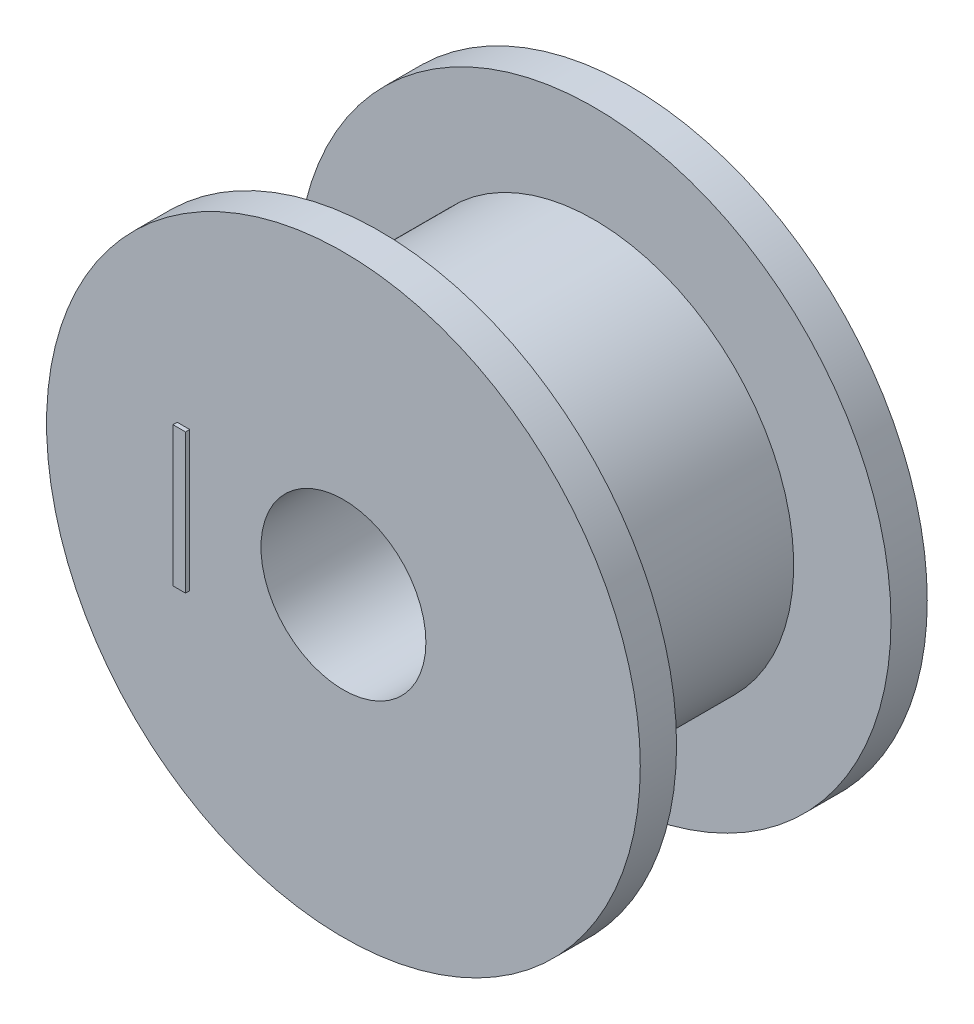
ISO-10303-21;
HEADER;
FILE_DESCRIPTION(('STEP AP214'),'2;1');
FILE_NAME('part.step','',(''),(''),'','','');
FILE_SCHEMA(('AUTOMOTIVE_DESIGN { 1 0 10303 214 1 1 1 1 }'));
ENDSEC;
DATA;
#1=APPLICATION_CONTEXT('core data for automotive mechanical design processes');
#2=APPLICATION_PROTOCOL_DEFINITION('international standard','automotive_design',2000,#1);
#3=PRODUCT_CONTEXT('',#1,'mechanical');
#4=PRODUCT('Part','Part','',(#3));
#5=PRODUCT_RELATED_PRODUCT_CATEGORY('part','',(#4));
#6=PRODUCT_DEFINITION_FORMATION('','',#4);
#7=PRODUCT_DEFINITION_CONTEXT('part definition',#1,'design');
#8=PRODUCT_DEFINITION('design','',#6,#7);
#9=PRODUCT_DEFINITION_SHAPE('','',#8);
#10=(LENGTH_UNIT() NAMED_UNIT(*) SI_UNIT(.MILLI.,.METRE.));
#11=(NAMED_UNIT(*) PLANE_ANGLE_UNIT() SI_UNIT($,.RADIAN.));
#12=(NAMED_UNIT(*) SI_UNIT($,.STERADIAN.) SOLID_ANGLE_UNIT());
#13=UNCERTAINTY_MEASURE_WITH_UNIT(LENGTH_MEASURE(1.E-05),#10,'distance_accuracy_value','');
#14=(GEOMETRIC_REPRESENTATION_CONTEXT(3) GLOBAL_UNCERTAINTY_ASSIGNED_CONTEXT((#13)) GLOBAL_UNIT_ASSIGNED_CONTEXT((#10,
#11,#12)) REPRESENTATION_CONTEXT('',''));
#15=CARTESIAN_POINT('',(0.,0.,0.));
#16=DIRECTION('',(0.,0.,1.));
#17=DIRECTION('',(1.,0.,0.));
#18=AXIS2_PLACEMENT_3D('',#15,#16,#17);
#19=CARTESIAN_POINT('',(0.,0.,1.1));
#20=DIRECTION('',(0.,0.,-1.));
#21=DIRECTION('',(-1.,0.,0.));
#22=AXIS2_PLACEMENT_3D('',#19,#20,#21);
#23=CYLINDRICAL_SURFACE('',#22,9.);
#24=CARTESIAN_POINT('',(0.,0.,1.1));
#25=DIRECTION('',(0.,0.,1.));
#26=DIRECTION('',(1.,0.,0.));
#27=AXIS2_PLACEMENT_3D('',#24,#25,#26);
#28=CIRCLE('',#27,9.);
#29=CARTESIAN_POINT('',(9.,0.,1.1));
#30=VERTEX_POINT('',#29);
#31=EDGE_CURVE('E11',#30,#30,#28,.T.);
#32=ORIENTED_EDGE('',*,*,#31,.F.);
#33=EDGE_LOOP('',(#32));
#34=FACE_BOUND('',#33,.T.);
#35=CARTESIAN_POINT('',(0.,0.,0.));
#36=DIRECTION('',(0.,0.,1.));
#37=DIRECTION('',(1.,0.,0.));
#38=AXIS2_PLACEMENT_3D('',#35,#36,#37);
#39=CIRCLE('',#38,9.);
#40=CARTESIAN_POINT('',(9.,0.,0.));
#41=VERTEX_POINT('',#40);
#42=EDGE_CURVE('E35',#41,#41,#39,.T.);
#43=ORIENTED_EDGE('',*,*,#42,.T.);
#44=EDGE_LOOP('',(#43));
#45=FACE_BOUND('',#44,.T.);
#46=ADVANCED_FACE('F32',(#34,#45),#23,.T.);
#47=CARTESIAN_POINT('',(0.,0.,1.1));
#48=DIRECTION('',(0.,0.,1.));
#49=DIRECTION('',(1.,0.,0.));
#50=AXIS2_PLACEMENT_3D('',#47,#48,#49);
#51=PLANE('',#50);
#52=CARTESIAN_POINT('',(0.,0.,1.1));
#53=DIRECTION('',(0.,0.,1.));
#54=DIRECTION('',(1.,0.,0.));
#55=AXIS2_PLACEMENT_3D('',#52,#53,#54);
#56=CIRCLE('',#55,6.05);
#57=CARTESIAN_POINT('',(-6.05,0.,1.1));
#58=VERTEX_POINT('',#57);
#59=EDGE_CURVE('E119',#58,#58,#56,.T.);
#60=ORIENTED_EDGE('',*,*,#59,.F.);
#61=EDGE_LOOP('',(#60));
#62=FACE_BOUND('',#61,.T.);
#63=ORIENTED_EDGE('',*,*,#31,.T.);
#64=EDGE_LOOP('',(#63));
#65=FACE_BOUND('',#64,.T.);
#66=ADVANCED_FACE('F130',(#62,#65),#51,.T.);
#67=CARTESIAN_POINT('',(0.,0.,0.));
#68=DIRECTION('',(0.,0.,1.));
#69=DIRECTION('',(1.,0.,0.));
#70=AXIS2_PLACEMENT_3D('',#67,#68,#69);
#71=PLANE('',#70);
#72=CARTESIAN_POINT('',(0.,0.,0.));
#73=DIRECTION('',(0.,0.,1.));
#74=DIRECTION('',(1.,0.,0.));
#75=AXIS2_PLACEMENT_3D('',#72,#73,#74);
#76=CIRCLE('',#75,2.5);
#77=CARTESIAN_POINT('',(2.5,0.,0.));
#78=VERTEX_POINT('',#77);
#79=EDGE_CURVE('E112',#78,#78,#76,.F.);
#80=ORIENTED_EDGE('',*,*,#79,.F.);
#81=EDGE_LOOP('',(#80));
#82=FACE_BOUND('',#81,.T.);
#83=ORIENTED_EDGE('',*,*,#42,.F.);
#84=EDGE_LOOP('',(#83));
#85=FACE_BOUND('',#84,.T.);
#86=ADVANCED_FACE('F133',(#82,#85),#71,.F.);
#87=CARTESIAN_POINT('',(0.,0.,7.6));
#88=DIRECTION('',(0.,0.,-1.));
#89=DIRECTION('',(-1.,0.,0.));
#90=AXIS2_PLACEMENT_3D('',#87,#88,#89);
#91=CYLINDRICAL_SURFACE('',#90,6.05);
#92=CARTESIAN_POINT('',(0.,0.,7.6));
#93=DIRECTION('',(0.,0.,1.));
#94=DIRECTION('',(1.,0.,0.));
#95=AXIS2_PLACEMENT_3D('',#92,#93,#94);
#96=CIRCLE('',#95,6.05);
#97=CARTESIAN_POINT('',(-6.05,0.,7.6));
#98=VERTEX_POINT('',#97);
#99=EDGE_CURVE('E122',#98,#98,#96,.T.);
#100=CARTESIAN_POINT('',(-6.05,0.,7.6));
#101=CARTESIAN_POINT('',(-6.05,0.,7.53229166666667));
#102=CARTESIAN_POINT('',(-6.05,0.,7.46458333333333));
#103=CARTESIAN_POINT('',(-6.05,0.,7.32916666666666));
#104=CARTESIAN_POINT('',(-6.05,0.,7.26145833333333));
#105=CARTESIAN_POINT('',(-6.05,0.,7.12604166666666));
#106=CARTESIAN_POINT('',(-6.05,0.,7.05833333333333));
#107=CARTESIAN_POINT('',(-6.05,0.,6.92291666666666));
#108=CARTESIAN_POINT('',(-6.05,0.,6.85520833333333));
#109=CARTESIAN_POINT('',(-6.05,0.,6.71979166666667));
#110=CARTESIAN_POINT('',(-6.05,0.,6.65208333333333));
#111=CARTESIAN_POINT('',(-6.05,0.,6.51666666666667));
#112=CARTESIAN_POINT('',(-6.05,0.,6.44895833333333));
#113=CARTESIAN_POINT('',(-6.05,0.,6.31354166666666));
#114=CARTESIAN_POINT('',(-6.05,0.,6.24583333333333));
#115=CARTESIAN_POINT('',(-6.05,0.,6.11041666666667));
#116=CARTESIAN_POINT('',(-6.05,0.,6.04270833333333));
#117=CARTESIAN_POINT('',(-6.05,0.,5.90729166666667));
#118=CARTESIAN_POINT('',(-6.05,0.,5.83958333333333));
#119=CARTESIAN_POINT('',(-6.05,0.,5.70416666666667));
#120=CARTESIAN_POINT('',(-6.05,0.,5.63645833333333));
#121=CARTESIAN_POINT('',(-6.05,0.,5.50104166666667));
#122=CARTESIAN_POINT('',(-6.05,0.,5.43333333333333));
#123=CARTESIAN_POINT('',(-6.05,0.,5.29791666666666));
#124=CARTESIAN_POINT('',(-6.05,0.,5.23020833333333));
#125=CARTESIAN_POINT('',(-6.05,0.,5.09479166666667));
#126=CARTESIAN_POINT('',(-6.05,0.,5.02708333333333));
#127=CARTESIAN_POINT('',(-6.05,0.,4.89166666666667));
#128=CARTESIAN_POINT('',(-6.05,0.,4.82395833333333));
#129=CARTESIAN_POINT('',(-6.05,0.,4.68854166666667));
#130=CARTESIAN_POINT('',(-6.05,0.,4.62083333333333));
#131=CARTESIAN_POINT('',(-6.05,0.,4.48541666666667));
#132=CARTESIAN_POINT('',(-6.05,0.,4.41770833333333));
#133=CARTESIAN_POINT('',(-6.05,0.,4.28229166666667));
#134=CARTESIAN_POINT('',(-6.05,0.,4.21458333333333));
#135=CARTESIAN_POINT('',(-6.05,0.,4.07916666666667));
#136=CARTESIAN_POINT('',(-6.05,0.,4.01145833333333));
#137=CARTESIAN_POINT('',(-6.05,0.,3.87604166666667));
#138=CARTESIAN_POINT('',(-6.05,0.,3.80833333333333));
#139=CARTESIAN_POINT('',(-6.05,0.,3.67291666666667));
#140=CARTESIAN_POINT('',(-6.05,0.,3.60520833333333));
#141=CARTESIAN_POINT('',(-6.05,0.,3.46979166666667));
#142=CARTESIAN_POINT('',(-6.05,0.,3.40208333333333));
#143=CARTESIAN_POINT('',(-6.05,0.,3.26666666666667));
#144=CARTESIAN_POINT('',(-6.05,0.,3.19895833333333));
#145=CARTESIAN_POINT('',(-6.05,0.,3.06354166666667));
#146=CARTESIAN_POINT('',(-6.05,0.,2.99583333333333));
#147=CARTESIAN_POINT('',(-6.05,0.,2.86041666666667));
#148=CARTESIAN_POINT('',(-6.05,0.,2.79270833333333));
#149=CARTESIAN_POINT('',(-6.05,0.,2.65729166666667));
#150=CARTESIAN_POINT('',(-6.05,0.,2.58958333333333));
#151=CARTESIAN_POINT('',(-6.05,0.,2.45416666666667));
#152=CARTESIAN_POINT('',(-6.05,0.,2.38645833333333));
#153=CARTESIAN_POINT('',(-6.05,0.,2.25104166666667));
#154=CARTESIAN_POINT('',(-6.05,0.,2.18333333333333));
#155=CARTESIAN_POINT('',(-6.05,0.,2.04791666666667));
#156=CARTESIAN_POINT('',(-6.05,0.,1.98020833333333));
#157=CARTESIAN_POINT('',(-6.05,0.,1.84479166666667));
#158=CARTESIAN_POINT('',(-6.05,0.,1.77708333333333));
#159=CARTESIAN_POINT('',(-6.05,0.,1.64166666666667));
#160=CARTESIAN_POINT('',(-6.05,0.,1.57395833333333));
#161=CARTESIAN_POINT('',(-6.05,0.,1.43854166666667));
#162=CARTESIAN_POINT('',(-6.05,0.,1.37083333333333));
#163=CARTESIAN_POINT('',(-6.05,0.,1.23541666666667));
#164=CARTESIAN_POINT('',(-6.05,0.,1.16770833333333));
#165=CARTESIAN_POINT('',(-6.05,0.,1.1));
#166=B_SPLINE_CURVE_WITH_KNOTS('',3,(#100,#101,#102,#103,#104,#105,#106,#107,#108,#109,#110,
#111,#112,#113,#114,#115,#116,#117,#118,#119,#120,#121,#122,#123,#124,#125,#126,#127,#128,#129,
#130,#131,#132,#133,#134,#135,#136,#137,#138,#139,#140,#141,#142,#143,#144,#145,#146,#147,#148,
#149,#150,#151,#152,#153,#154,#155,#156,#157,#158,#159,#160,#161,#162,#163,#164,#165),
.UNSPECIFIED.,.F.,.F.,(4,2,2,2,2,2,2,2,2,2,2,2,2,2,2,2,2,2,2,2,2,2,2,2,2,2,2,2,2,2,2,2,4),(0.,
0.203124999999999,0.40625,0.609375,0.8125,1.015625,1.21875,1.421875,1.625,1.828125,2.03125,
2.234375,2.4375,2.640625,2.84375,3.046875,3.25,3.453125,3.65625,3.859375,4.0625,4.265625,
4.46875,4.671875,4.875,5.078125,5.28125,5.484375,5.6875,5.890625,6.09375,6.296875,6.5),.UNSPECIFIED.);
#167=EDGE_CURVE('BSEAM128',#98,#58,#166,.T.);
#168=ORIENTED_EDGE('',*,*,#99,.F.);
#169=ORIENTED_EDGE('',*,*,#59,.T.);
#170=ORIENTED_EDGE('',*,*,#167,.T.);
#171=ORIENTED_EDGE('',*,*,#167,.F.);
#172=EDGE_LOOP('',(#168,#170,#169,#171));
#173=FACE_BOUND('',#172,.T.);
#174=ADVANCED_FACE('F128',(#173),#91,.T.);
#175=CARTESIAN_POINT('',(0.,0.,8.7));
#176=DIRECTION('',(0.,0.,-1.));
#177=DIRECTION('',(-1.,0.,0.));
#178=AXIS2_PLACEMENT_3D('',#175,#176,#177);
#179=CYLINDRICAL_SURFACE('',#178,9.);
#180=CARTESIAN_POINT('',(0.,0.,8.7));
#181=DIRECTION('',(0.,0.,1.));
#182=DIRECTION('',(1.,0.,0.));
#183=AXIS2_PLACEMENT_3D('',#180,#181,#182);
#184=CIRCLE('',#183,9.);
#185=CARTESIAN_POINT('',(9.,0.,8.7));
#186=VERTEX_POINT('',#185);
#187=EDGE_CURVE('E116',#186,#186,#184,.T.);
#188=ORIENTED_EDGE('',*,*,#187,.F.);
#189=EDGE_LOOP('',(#188));
#190=FACE_BOUND('',#189,.T.);
#191=CARTESIAN_POINT('',(0.,0.,7.6));
#192=DIRECTION('',(0.,0.,1.));
#193=DIRECTION('',(1.,0.,0.));
#194=AXIS2_PLACEMENT_3D('',#191,#192,#193);
#195=CIRCLE('',#194,9.);
#196=CARTESIAN_POINT('',(9.,0.,7.6));
#197=VERTEX_POINT('',#196);
#198=EDGE_CURVE('E115',#197,#197,#195,.T.);
#199=ORIENTED_EDGE('',*,*,#198,.T.);
#200=EDGE_LOOP('',(#199));
#201=FACE_BOUND('',#200,.T.);
#202=ADVANCED_FACE('F147',(#190,#201),#179,.T.);
#203=CARTESIAN_POINT('',(0.,0.,8.7));
#204=DIRECTION('',(0.,0.,1.));
#205=DIRECTION('',(1.,0.,0.));
#206=AXIS2_PLACEMENT_3D('',#203,#204,#205);
#207=PLANE('',#206);
#208=DIRECTION('',(0.,1.,0.));
#209=VECTOR('',#208,1.);
#210=CARTESIAN_POINT('',(-5.04022385734294,-2.22463535965289,8.7));
#211=LINE('',#210,#209);
#212=CARTESIAN_POINT('',(-5.04022385734294,-2.22463535965289,8.7));
#213=VERTEX_POINT('',#212);
#214=CARTESIAN_POINT('',(-5.04022385734294,2.00869797368044,8.7));
#215=VERTEX_POINT('',#214);
#216=EDGE_CURVE('E101',#213,#215,#211,.T.);
#217=ORIENTED_EDGE('',*,*,#216,.T.);
#218=DIRECTION('',(1.,0.,0.));
#219=VECTOR('',#218,1.);
#220=CARTESIAN_POINT('',(-5.04022385734294,2.00869797368044,8.7));
#221=LINE('',#220,#219);
#222=CARTESIAN_POINT('',(-4.66030932742841,2.00869797368044,8.7));
#223=VERTEX_POINT('',#222);
#224=EDGE_CURVE('E77',#215,#223,#221,.T.);
#225=ORIENTED_EDGE('',*,*,#224,.T.);
#226=DIRECTION('',(0.,-1.,0.));
#227=VECTOR('',#226,1.);
#228=CARTESIAN_POINT('',(-4.66030932742841,2.00869797368044,8.7));
#229=LINE('',#228,#227);
#230=CARTESIAN_POINT('',(-4.66030932742841,-2.22463535965289,8.7));
#231=VERTEX_POINT('',#230);
#232=EDGE_CURVE('E51',#223,#231,#229,.T.);
#233=ORIENTED_EDGE('',*,*,#232,.T.);
#234=DIRECTION('',(-1.,0.,0.));
#235=VECTOR('',#234,1.);
#236=CARTESIAN_POINT('',(-4.66030932742841,-2.22463535965289,8.7));
#237=LINE('',#236,#235);
#238=EDGE_CURVE('E46',#231,#213,#237,.T.);
#239=ORIENTED_EDGE('',*,*,#238,.T.);
#240=EDGE_LOOP('',(#217,#225,#233,#239));
#241=FACE_BOUND('',#240,.T.);
#242=CARTESIAN_POINT('',(0.,0.,8.7));
#243=DIRECTION('',(0.,0.,1.));
#244=DIRECTION('',(1.,0.,0.));
#245=AXIS2_PLACEMENT_3D('',#242,#243,#244);
#246=CIRCLE('',#245,2.5);
#247=CARTESIAN_POINT('',(2.5,0.,8.7));
#248=VERTEX_POINT('',#247);
#249=EDGE_CURVE('E106',#248,#248,#246,.T.);
#250=ORIENTED_EDGE('',*,*,#249,.F.);
#251=EDGE_LOOP('',(#250));
#252=FACE_BOUND('',#251,.T.);
#253=ORIENTED_EDGE('',*,*,#187,.T.);
#254=EDGE_LOOP('',(#253));
#255=FACE_BOUND('',#254,.T.);
#256=ADVANCED_FACE('F154',(#241,#252,#255),#207,.T.);
#257=CARTESIAN_POINT('',(0.,0.,7.6));
#258=DIRECTION('',(0.,0.,1.));
#259=DIRECTION('',(1.,0.,0.));
#260=AXIS2_PLACEMENT_3D('',#257,#258,#259);
#261=PLANE('',#260);
#262=ORIENTED_EDGE('',*,*,#99,.T.);
#263=EDGE_LOOP('',(#262));
#264=FACE_BOUND('',#263,.T.);
#265=ORIENTED_EDGE('',*,*,#198,.F.);
#266=EDGE_LOOP('',(#265));
#267=FACE_BOUND('',#266,.T.);
#268=ADVANCED_FACE('F156',(#264,#267),#261,.F.);
#269=CARTESIAN_POINT('',(0.,0.,-0.000999999999999265));
#270=DIRECTION('',(0.,0.,1.));
#271=DIRECTION('',(1.,0.,0.));
#272=AXIS2_PLACEMENT_3D('',#269,#270,#271);
#273=CYLINDRICAL_SURFACE('',#272,2.5);
#274=ORIENTED_EDGE('',*,*,#249,.T.);
#275=EDGE_LOOP('',(#274));
#276=FACE_BOUND('',#275,.T.);
#277=ORIENTED_EDGE('',*,*,#79,.T.);
#278=EDGE_LOOP('',(#277));
#279=FACE_BOUND('',#278,.T.);
#280=ADVANCED_FACE('F159',(#276,#279),#273,.F.);
#281=CARTESIAN_POINT('',(-5.04022385734294,-2.22463535965289,8.827));
#282=DIRECTION('',(-1.,0.,0.));
#283=DIRECTION('',(0.,0.,1.));
#284=AXIS2_PLACEMENT_3D('',#281,#282,#283);
#285=PLANE('',#284);
#286=ORIENTED_EDGE('',*,*,#216,.F.);
#287=DIRECTION('',(0.,0.,-1.));
#288=VECTOR('',#287,1.);
#289=CARTESIAN_POINT('',(-5.04022385734294,-2.22463535965289,8.827));
#290=LINE('',#289,#288);
#291=CARTESIAN_POINT('',(-5.04022385734294,-2.22463535965289,8.827));
#292=VERTEX_POINT('',#291);
#293=EDGE_CURVE('E95',#292,#213,#290,.T.);
#294=ORIENTED_EDGE('',*,*,#293,.F.);
#295=DIRECTION('',(0.,1.,0.));
#296=VECTOR('',#295,1.);
#297=CARTESIAN_POINT('',(-5.04022385734294,-2.22463535965289,8.827));
#298=LINE('',#297,#296);
#299=CARTESIAN_POINT('',(-5.04022385734294,2.00869797368044,8.827));
#300=VERTEX_POINT('',#299);
#301=EDGE_CURVE('E89',#292,#300,#298,.T.);
#302=ORIENTED_EDGE('',*,*,#301,.T.);
#303=DIRECTION('',(0.,0.,-1.));
#304=VECTOR('',#303,1.);
#305=CARTESIAN_POINT('',(-5.04022385734294,2.00869797368044,8.827));
#306=LINE('',#305,#304);
#307=EDGE_CURVE('E72',#300,#215,#306,.T.);
#308=ORIENTED_EDGE('',*,*,#307,.T.);
#309=EDGE_LOOP('',(#286,#294,#302,#308));
#310=FACE_BOUND('',#309,.T.);
#311=ADVANCED_FACE('F94',(#310),#285,.T.);
#312=CARTESIAN_POINT('',(-4.66030932742841,-2.22463535965289,8.827));
#313=DIRECTION('',(0.,-1.,0.));
#314=DIRECTION('',(0.,0.,-1.));
#315=AXIS2_PLACEMENT_3D('',#312,#313,#314);
#316=PLANE('',#315);
#317=ORIENTED_EDGE('',*,*,#238,.F.);
#318=DIRECTION('',(0.,0.,-1.));
#319=VECTOR('',#318,1.);
#320=CARTESIAN_POINT('',(-4.66030932742841,-2.22463535965289,8.827));
#321=LINE('',#320,#319);
#322=CARTESIAN_POINT('',(-4.66030932742841,-2.22463535965289,8.827));
#323=VERTEX_POINT('',#322);
#324=EDGE_CURVE('E107',#323,#231,#321,.T.);
#325=ORIENTED_EDGE('',*,*,#324,.F.);
#326=DIRECTION('',(-1.,0.,0.));
#327=VECTOR('',#326,1.);
#328=CARTESIAN_POINT('',(-4.66030932742841,-2.22463535965289,8.827));
#329=LINE('',#328,#327);
#330=EDGE_CURVE('E82',#323,#292,#329,.T.);
#331=ORIENTED_EDGE('',*,*,#330,.T.);
#332=ORIENTED_EDGE('',*,*,#293,.T.);
#333=EDGE_LOOP('',(#317,#325,#331,#332));
#334=FACE_BOUND('',#333,.T.);
#335=ADVANCED_FACE('F168',(#334),#316,.T.);
#336=CARTESIAN_POINT('',(-4.66030932742841,2.00869797368044,8.827));
#337=DIRECTION('',(1.,0.,0.));
#338=DIRECTION('',(0.,0.,-1.));
#339=AXIS2_PLACEMENT_3D('',#336,#337,#338);
#340=PLANE('',#339);
#341=ORIENTED_EDGE('',*,*,#232,.F.);
#342=DIRECTION('',(0.,0.,-1.));
#343=VECTOR('',#342,1.);
#344=CARTESIAN_POINT('',(-4.66030932742841,2.00869797368044,8.827));
#345=LINE('',#344,#343);
#346=CARTESIAN_POINT('',(-4.66030932742841,2.00869797368044,8.827));
#347=VERTEX_POINT('',#346);
#348=EDGE_CURVE('E81',#347,#223,#345,.T.);
#349=ORIENTED_EDGE('',*,*,#348,.F.);
#350=DIRECTION('',(0.,-1.,0.));
#351=VECTOR('',#350,1.);
#352=CARTESIAN_POINT('',(-4.66030932742841,2.00869797368044,8.827));
#353=LINE('',#352,#351);
#354=EDGE_CURVE('E92',#347,#323,#353,.T.);
#355=ORIENTED_EDGE('',*,*,#354,.T.);
#356=ORIENTED_EDGE('',*,*,#324,.T.);
#357=EDGE_LOOP('',(#341,#349,#355,#356));
#358=FACE_BOUND('',#357,.T.);
#359=ADVANCED_FACE('F171',(#358),#340,.T.);
#360=CARTESIAN_POINT('',(-5.04022385734294,2.00869797368044,8.827));
#361=DIRECTION('',(0.,1.,0.));
#362=DIRECTION('',(0.,0.,1.));
#363=AXIS2_PLACEMENT_3D('',#360,#361,#362);
#364=PLANE('',#363);
#365=ORIENTED_EDGE('',*,*,#224,.F.);
#366=ORIENTED_EDGE('',*,*,#307,.F.);
#367=DIRECTION('',(1.,0.,0.));
#368=VECTOR('',#367,1.);
#369=CARTESIAN_POINT('',(-5.04022385734294,2.00869797368044,8.827));
#370=LINE('',#369,#368);
#371=EDGE_CURVE('E76',#300,#347,#370,.T.);
#372=ORIENTED_EDGE('',*,*,#371,.T.);
#373=ORIENTED_EDGE('',*,*,#348,.T.);
#374=EDGE_LOOP('',(#365,#366,#372,#373));
#375=FACE_BOUND('',#374,.T.);
#376=ADVANCED_FACE('F74',(#375),#364,.T.);
#377=CARTESIAN_POINT('',(0.,0.,8.827));
#378=DIRECTION('',(0.,0.,-1.));
#379=DIRECTION('',(-1.,0.,0.));
#380=AXIS2_PLACEMENT_3D('',#377,#378,#379);
#381=PLANE('',#380);
#382=ORIENTED_EDGE('',*,*,#301,.F.);
#383=ORIENTED_EDGE('',*,*,#330,.F.);
#384=ORIENTED_EDGE('',*,*,#354,.F.);
#385=ORIENTED_EDGE('',*,*,#371,.F.);
#386=EDGE_LOOP('',(#382,#383,#384,#385));
#387=FACE_BOUND('',#386,.T.);
#388=ADVANCED_FACE('F87',(#387),#381,.F.);
#389=CLOSED_SHELL('',(#46,#66,#86,#174,#202,#256,#268,#280,#311,#335,#359,#376,#388));
#390=MANIFOLD_SOLID_BREP('B2',#389);
#391=ADVANCED_BREP_SHAPE_REPRESENTATION('',(#18,#390),#14);
#392=SHAPE_DEFINITION_REPRESENTATION(#9,#391);
ENDSEC;
END-ISO-10303-21;
